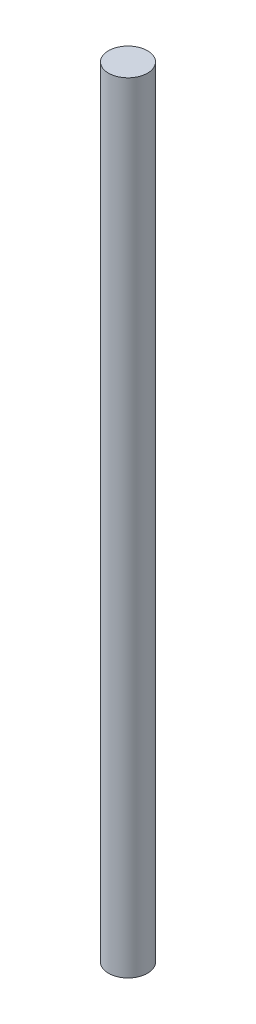
ISO-10303-21;
HEADER;
FILE_DESCRIPTION(('STEP AP214'),'2;1');
FILE_NAME('part.step','',(''),(''),'','','');
FILE_SCHEMA(('AUTOMOTIVE_DESIGN { 1 0 10303 214 1 1 1 1 }'));
ENDSEC;
DATA;
#1=APPLICATION_CONTEXT('core data for automotive mechanical design processes');
#2=APPLICATION_PROTOCOL_DEFINITION('international standard','automotive_design',2000,#1);
#3=PRODUCT_CONTEXT('',#1,'mechanical');
#4=PRODUCT('Part','Part','',(#3));
#5=PRODUCT_RELATED_PRODUCT_CATEGORY('part','',(#4));
#6=PRODUCT_DEFINITION_FORMATION('','',#4);
#7=PRODUCT_DEFINITION_CONTEXT('part definition',#1,'design');
#8=PRODUCT_DEFINITION('design','',#6,#7);
#9=PRODUCT_DEFINITION_SHAPE('','',#8);
#10=(LENGTH_UNIT() NAMED_UNIT(*) SI_UNIT(.MILLI.,.METRE.));
#11=(NAMED_UNIT(*) PLANE_ANGLE_UNIT() SI_UNIT($,.RADIAN.));
#12=(NAMED_UNIT(*) SI_UNIT($,.STERADIAN.) SOLID_ANGLE_UNIT());
#13=UNCERTAINTY_MEASURE_WITH_UNIT(LENGTH_MEASURE(1.E-05),#10,'distance_accuracy_value','');
#14=(GEOMETRIC_REPRESENTATION_CONTEXT(3) GLOBAL_UNCERTAINTY_ASSIGNED_CONTEXT((#13)) GLOBAL_UNIT_ASSIGNED_CONTEXT((#10,
#11,#12)) REPRESENTATION_CONTEXT('',''));
#15=CARTESIAN_POINT('',(0.,0.,0.));
#16=DIRECTION('',(0.,0.,1.));
#17=DIRECTION('',(1.,0.,0.));
#18=AXIS2_PLACEMENT_3D('',#15,#16,#17);
#19=CARTESIAN_POINT('',(0.,70.,0.));
#20=DIRECTION('',(0.,-1.,0.));
#21=DIRECTION('',(0.,0.,-1.));
#22=AXIS2_PLACEMENT_3D('',#19,#20,#21);
#23=CYLINDRICAL_SURFACE('',#22,1.75);
#24=CARTESIAN_POINT('',(0.,70.,0.));
#25=DIRECTION('',(0.,1.,0.));
#26=DIRECTION('',(0.,0.,1.));
#27=AXIS2_PLACEMENT_3D('',#24,#25,#26);
#28=CIRCLE('',#27,1.75);
#29=CARTESIAN_POINT('',(0.,70.,1.75));
#30=VERTEX_POINT('',#29);
#31=EDGE_CURVE('E10',#30,#30,#28,.T.);
#32=ORIENTED_EDGE('',*,*,#31,.F.);
#33=EDGE_LOOP('',(#32));
#34=FACE_BOUND('',#33,.T.);
#35=CARTESIAN_POINT('',(0.,0.,0.));
#36=DIRECTION('',(0.,1.,0.));
#37=DIRECTION('',(0.,0.,1.));
#38=AXIS2_PLACEMENT_3D('',#35,#36,#37);
#39=CIRCLE('',#38,1.75);
#40=CARTESIAN_POINT('',(0.,0.,1.75));
#41=VERTEX_POINT('',#40);
#42=EDGE_CURVE('E33',#41,#41,#39,.T.);
#43=ORIENTED_EDGE('',*,*,#42,.T.);
#44=EDGE_LOOP('',(#43));
#45=FACE_BOUND('',#44,.T.);
#46=ADVANCED_FACE('F30',(#34,#45),#23,.T.);
#47=CARTESIAN_POINT('',(0.,70.,0.));
#48=DIRECTION('',(0.,1.,0.));
#49=DIRECTION('',(0.,0.,1.));
#50=AXIS2_PLACEMENT_3D('',#47,#48,#49);
#51=PLANE('',#50);
#52=ORIENTED_EDGE('',*,*,#31,.T.);
#53=EDGE_LOOP('',(#52));
#54=FACE_BOUND('',#53,.T.);
#55=ADVANCED_FACE('F45',(#54),#51,.T.);
#56=CARTESIAN_POINT('',(0.,0.,0.));
#57=DIRECTION('',(0.,1.,0.));
#58=DIRECTION('',(0.,0.,1.));
#59=AXIS2_PLACEMENT_3D('',#56,#57,#58);
#60=PLANE('',#59);
#61=ORIENTED_EDGE('',*,*,#42,.F.);
#62=EDGE_LOOP('',(#61));
#63=FACE_BOUND('',#62,.T.);
#64=ADVANCED_FACE('F43',(#63),#60,.F.);
#65=CLOSED_SHELL('',(#46,#55,#64));
#66=MANIFOLD_SOLID_BREP('B2',#65);
#67=ADVANCED_BREP_SHAPE_REPRESENTATION('',(#18,#66),#14);
#68=SHAPE_DEFINITION_REPRESENTATION(#9,#67);
ENDSEC;
END-ISO-10303-21;
